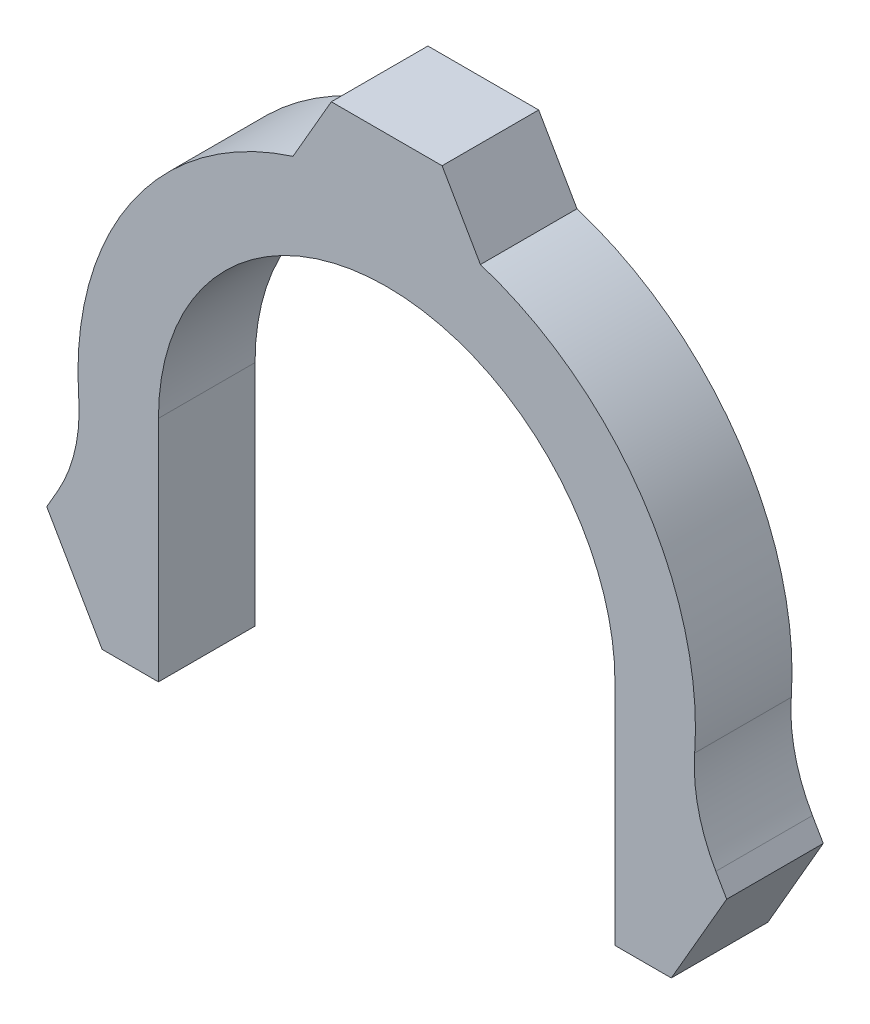
ISO-10303-21;
HEADER;
FILE_DESCRIPTION(('STEP AP214'),'2;1');
FILE_NAME('part.step','',(''),(''),'','','');
FILE_SCHEMA(('AUTOMOTIVE_DESIGN { 1 0 10303 214 1 1 1 1 }'));
ENDSEC;
DATA;
#1=APPLICATION_CONTEXT('core data for automotive mechanical design processes');
#2=APPLICATION_PROTOCOL_DEFINITION('international standard','automotive_design',2000,#1);
#3=PRODUCT_CONTEXT('',#1,'mechanical');
#4=PRODUCT('Part','Part','',(#3));
#5=PRODUCT_RELATED_PRODUCT_CATEGORY('part','',(#4));
#6=PRODUCT_DEFINITION_FORMATION('','',#4);
#7=PRODUCT_DEFINITION_CONTEXT('part definition',#1,'design');
#8=PRODUCT_DEFINITION('design','',#6,#7);
#9=PRODUCT_DEFINITION_SHAPE('','',#8);
#10=(LENGTH_UNIT() NAMED_UNIT(*) SI_UNIT(.MILLI.,.METRE.));
#11=(NAMED_UNIT(*) PLANE_ANGLE_UNIT() SI_UNIT($,.RADIAN.));
#12=(NAMED_UNIT(*) SI_UNIT($,.STERADIAN.) SOLID_ANGLE_UNIT());
#13=UNCERTAINTY_MEASURE_WITH_UNIT(LENGTH_MEASURE(1.E-05),#10,'distance_accuracy_value','');
#14=(GEOMETRIC_REPRESENTATION_CONTEXT(3) GLOBAL_UNCERTAINTY_ASSIGNED_CONTEXT((#13)) GLOBAL_UNIT_ASSIGNED_CONTEXT((#10,
#11,#12)) REPRESENTATION_CONTEXT('',''));
#15=CARTESIAN_POINT('',(0.,0.,0.));
#16=DIRECTION('',(0.,0.,1.));
#17=DIRECTION('',(1.,0.,0.));
#18=AXIS2_PLACEMENT_3D('',#15,#16,#17);
#19=CARTESIAN_POINT('',(13.0760529111176,45.988107250102,12.));
#20=DIRECTION('',(0.,0.,-1.));
#21=DIRECTION('',(-1.,0.,0.));
#22=AXIS2_PLACEMENT_3D('',#19,#20,#21);
#23=CYLINDRICAL_SURFACE('',#22,20.);
#24=CARTESIAN_POINT('',(13.0760529111176,45.988107250102,0.));
#25=DIRECTION('',(0.,0.,-1.));
#26=DIRECTION('',(-1.,0.,0.));
#27=AXIS2_PLACEMENT_3D('',#24,#25,#26);
#28=CIRCLE('',#27,20.);
#29=CARTESIAN_POINT('',(-4.24445516457117,35.988107250102,0.));
#30=VERTEX_POINT('',#29);
#31=CARTESIAN_POINT('',(-6.8742487352404,47.3971722661056,0.));
#32=VERTEX_POINT('',#31);
#33=EDGE_CURVE('E178',#30,#32,#28,.T.);
#34=ORIENTED_EDGE('',*,*,#33,.T.);
#35=DIRECTION('',(0.,0.,-1.));
#36=VECTOR('',#35,1.);
#37=CARTESIAN_POINT('',(-6.8742487352404,47.3971722661056,12.));
#38=LINE('',#37,#36);
#39=CARTESIAN_POINT('',(-6.8742487352404,47.3971722661056,12.));
#40=VERTEX_POINT('',#39);
#41=EDGE_CURVE('E11',#40,#32,#38,.T.);
#42=ORIENTED_EDGE('',*,*,#41,.F.);
#43=CARTESIAN_POINT('',(13.0760529111176,45.988107250102,12.));
#44=DIRECTION('',(0.,0.,-1.));
#45=DIRECTION('',(-1.,0.,0.));
#46=AXIS2_PLACEMENT_3D('',#43,#44,#45);
#47=CIRCLE('',#46,20.);
#48=CARTESIAN_POINT('',(-4.24445516457117,35.988107250102,12.));
#49=VERTEX_POINT('',#48);
#50=EDGE_CURVE('E179',#49,#40,#47,.T.);
#51=ORIENTED_EDGE('',*,*,#50,.F.);
#52=DIRECTION('',(0.,0.,-1.));
#53=VECTOR('',#52,1.);
#54=CARTESIAN_POINT('',(-4.24445516457117,35.988107250102,12.));
#55=LINE('',#54,#53);
#56=EDGE_CURVE('E189',#49,#30,#55,.T.);
#57=ORIENTED_EDGE('',*,*,#56,.T.);
#58=EDGE_LOOP('',(#34,#42,#51,#57));
#59=FACE_BOUND('',#58,.T.);
#60=ADVANCED_FACE('F41',(#59),#23,.F.);
#61=CARTESIAN_POINT('',(-45.1379136666298,50.0996873756325,12.));
#62=DIRECTION('',(0.,0.,-1.));
#63=DIRECTION('',(-1.,0.,0.));
#64=AXIS2_PLACEMENT_3D('',#61,#62,#63);
#65=CYLINDRICAL_SURFACE('',#64,38.3589838486223);
#66=CARTESIAN_POINT('',(-45.1379136666298,50.0996873756325,0.));
#67=DIRECTION('',(0.,0.,1.));
#68=DIRECTION('',(1.,0.,0.));
#69=AXIS2_PLACEMENT_3D('',#66,#67,#68);
#70=CIRCLE('',#69,38.3589838486223);
#71=CARTESIAN_POINT('',(-33.4932239612782,86.6484608648338,0.));
#72=VERTEX_POINT('',#71);
#73=EDGE_CURVE('E222',#32,#72,#70,.T.);
#74=ORIENTED_EDGE('',*,*,#73,.T.);
#75=DIRECTION('',(0.,0.,-1.));
#76=VECTOR('',#75,1.);
#77=CARTESIAN_POINT('',(-33.4932239612782,86.6484608648338,12.));
#78=LINE('',#77,#76);
#79=CARTESIAN_POINT('',(-33.4932239612782,86.6484608648338,12.));
#80=VERTEX_POINT('',#79);
#81=EDGE_CURVE('E48',#80,#72,#78,.T.);
#82=ORIENTED_EDGE('',*,*,#81,.F.);
#83=CARTESIAN_POINT('',(-45.1379136666298,50.0996873756325,12.));
#84=DIRECTION('',(0.,0.,1.));
#85=DIRECTION('',(1.,0.,0.));
#86=AXIS2_PLACEMENT_3D('',#83,#84,#85);
#87=CIRCLE('',#86,38.3589838486223);
#88=EDGE_CURVE('E183',#40,#80,#87,.T.);
#89=ORIENTED_EDGE('',*,*,#88,.F.);
#90=ORIENTED_EDGE('',*,*,#41,.T.);
#91=EDGE_LOOP('',(#74,#82,#89,#90));
#92=FACE_BOUND('',#91,.T.);
#93=ADVANCED_FACE('F338',(#92),#65,.T.);
#94=CARTESIAN_POINT('',(-33.4932239612782,86.6484608648338,12.));
#95=DIRECTION('',(-0.866025403784438,-0.500000000000001,0.));
#96=DIRECTION('',(0.500000000000001,-0.866025403784438,0.));
#97=AXIS2_PLACEMENT_3D('',#94,#95,#96);
#98=PLANE('',#97);
#99=DIRECTION('',(-0.500000000000001,0.866025403784438,0.));
#100=VECTOR('',#99,1.);
#101=CARTESIAN_POINT('',(-33.4932239612782,86.6484608648338,0.));
#102=LINE('',#101,#100);
#103=CARTESIAN_POINT('',(-38.2570718084324,94.8996873756326,0.));
#104=VERTEX_POINT('',#103);
#105=EDGE_CURVE('E218',#72,#104,#102,.T.);
#106=ORIENTED_EDGE('',*,*,#105,.T.);
#107=DIRECTION('',(0.,0.,1.));
#108=VECTOR('',#107,1.);
#109=CARTESIAN_POINT('',(-38.2570718084324,94.8996873756326,0.));
#110=LINE('',#109,#108);
#111=CARTESIAN_POINT('',(-38.2570718084324,94.8996873756326,12.));
#112=VERTEX_POINT('',#111);
#113=EDGE_CURVE('E57',#104,#112,#110,.T.);
#114=ORIENTED_EDGE('',*,*,#113,.T.);
#115=DIRECTION('',(-0.500000000000001,0.866025403784438,0.));
#116=VECTOR('',#115,1.);
#117=CARTESIAN_POINT('',(-33.4932239612782,86.6484608648338,12.));
#118=LINE('',#117,#116);
#119=EDGE_CURVE('E220',#80,#112,#118,.T.);
#120=ORIENTED_EDGE('',*,*,#119,.F.);
#121=ORIENTED_EDGE('',*,*,#81,.T.);
#122=EDGE_LOOP('',(#106,#114,#120,#121));
#123=FACE_BOUND('',#122,.T.);
#124=ADVANCED_FACE('F217',(#123),#98,.F.);
#125=CARTESIAN_POINT('',(-45.1379136666299,106.817655072877,12.));
#126=DIRECTION('',(0.866025403784439,-0.5,0.));
#127=DIRECTION('',(0.5,0.866025403784439,0.));
#128=AXIS2_PLACEMENT_3D('',#125,#126,#127);
#129=PLANE('',#128);
#130=DIRECTION('',(-0.5,-0.866025403784439,0.));
#131=VECTOR('',#130,1.);
#132=CARTESIAN_POINT('',(-45.1379136666299,106.817655072877,12.));
#133=LINE('',#132,#131);
#134=CARTESIAN_POINT('',(-52.0187555248272,94.8996873756326,12.));
#135=VERTEX_POINT('',#134);
#136=CARTESIAN_POINT('',(-56.7826033719815,86.6484608648338,12.));
#137=VERTEX_POINT('',#136);
#138=EDGE_CURVE('E287',#135,#137,#133,.T.);
#139=ORIENTED_EDGE('',*,*,#138,.F.);
#140=DIRECTION('',(0.,0.,1.));
#141=VECTOR('',#140,1.);
#142=CARTESIAN_POINT('',(-52.0187555248272,94.8996873756326,0.));
#143=LINE('',#142,#141);
#144=CARTESIAN_POINT('',(-52.0187555248272,94.8996873756326,0.));
#145=VERTEX_POINT('',#144);
#146=EDGE_CURVE('E278',#145,#135,#143,.T.);
#147=ORIENTED_EDGE('',*,*,#146,.F.);
#148=DIRECTION('',(-0.5,-0.866025403784439,0.));
#149=VECTOR('',#148,1.);
#150=CARTESIAN_POINT('',(-45.1379136666299,106.817655072877,0.));
#151=LINE('',#150,#149);
#152=CARTESIAN_POINT('',(-56.7826033719815,86.6484608648338,0.));
#153=VERTEX_POINT('',#152);
#154=EDGE_CURVE('E226',#145,#153,#151,.T.);
#155=ORIENTED_EDGE('',*,*,#154,.T.);
#156=DIRECTION('',(0.,0.,-1.));
#157=VECTOR('',#156,1.);
#158=CARTESIAN_POINT('',(-56.7826033719815,86.6484608648338,12.));
#159=LINE('',#158,#157);
#160=EDGE_CURVE('E209',#137,#153,#159,.T.);
#161=ORIENTED_EDGE('',*,*,#160,.F.);
#162=EDGE_LOOP('',(#139,#147,#155,#161));
#163=FACE_BOUND('',#162,.T.);
#164=ADVANCED_FACE('F333',(#163),#129,.F.);
#165=CARTESIAN_POINT('',(-45.1379136666298,50.0996873756325,12.));
#166=DIRECTION('',(0.,0.,-1.));
#167=DIRECTION('',(-1.,0.,0.));
#168=AXIS2_PLACEMENT_3D('',#165,#166,#167);
#169=CYLINDRICAL_SURFACE('',#168,38.3589838486223);
#170=CARTESIAN_POINT('',(-45.1379136666298,50.0996873756325,0.));
#171=DIRECTION('',(0.,0.,1.));
#172=DIRECTION('',(1.,0.,0.));
#173=AXIS2_PLACEMENT_3D('',#170,#171,#172);
#174=CIRCLE('',#173,38.3589838486223);
#175=CARTESIAN_POINT('',(-83.4015785980193,47.3971722661056,0.));
#176=VERTEX_POINT('',#175);
#177=EDGE_CURVE('E230',#153,#176,#174,.T.);
#178=ORIENTED_EDGE('',*,*,#177,.T.);
#179=DIRECTION('',(0.,0.,-1.));
#180=VECTOR('',#179,1.);
#181=CARTESIAN_POINT('',(-83.4015785980193,47.3971722661056,12.));
#182=LINE('',#181,#180);
#183=CARTESIAN_POINT('',(-83.4015785980193,47.3971722661056,12.));
#184=VERTEX_POINT('',#183);
#185=EDGE_CURVE('E206',#184,#176,#182,.T.);
#186=ORIENTED_EDGE('',*,*,#185,.F.);
#187=CARTESIAN_POINT('',(-45.1379136666298,50.0996873756325,12.));
#188=DIRECTION('',(0.,0.,1.));
#189=DIRECTION('',(1.,0.,0.));
#190=AXIS2_PLACEMENT_3D('',#187,#188,#189);
#191=CIRCLE('',#190,38.3589838486223);
#192=EDGE_CURVE('E289',#137,#184,#191,.T.);
#193=ORIENTED_EDGE('',*,*,#192,.F.);
#194=ORIENTED_EDGE('',*,*,#160,.T.);
#195=EDGE_LOOP('',(#178,#186,#193,#194));
#196=FACE_BOUND('',#195,.T.);
#197=ADVANCED_FACE('F329',(#196),#169,.T.);
#198=CARTESIAN_POINT('',(-103.351880244377,45.988107250102,12.));
#199=DIRECTION('',(0.,0.,-1.));
#200=DIRECTION('',(-1.,0.,0.));
#201=AXIS2_PLACEMENT_3D('',#198,#199,#200);
#202=CYLINDRICAL_SURFACE('',#201,20.);
#203=CARTESIAN_POINT('',(-103.351880244377,45.988107250102,0.));
#204=DIRECTION('',(0.,0.,-1.));
#205=DIRECTION('',(-1.,0.,0.));
#206=AXIS2_PLACEMENT_3D('',#203,#204,#205);
#207=CIRCLE('',#206,20.);
#208=CARTESIAN_POINT('',(-86.0313721686885,35.988107250102,0.));
#209=VERTEX_POINT('',#208);
#210=EDGE_CURVE('E236',#176,#209,#207,.T.);
#211=ORIENTED_EDGE('',*,*,#210,.T.);
#212=DIRECTION('',(0.,0.,-1.));
#213=VECTOR('',#212,1.);
#214=CARTESIAN_POINT('',(-86.0313721686885,35.988107250102,12.));
#215=LINE('',#214,#213);
#216=CARTESIAN_POINT('',(-86.0313721686885,35.988107250102,12.));
#217=VERTEX_POINT('',#216);
#218=EDGE_CURVE('E203',#217,#209,#215,.T.);
#219=ORIENTED_EDGE('',*,*,#218,.F.);
#220=CARTESIAN_POINT('',(-103.351880244377,45.988107250102,12.));
#221=DIRECTION('',(0.,0.,-1.));
#222=DIRECTION('',(-1.,0.,0.));
#223=AXIS2_PLACEMENT_3D('',#220,#221,#222);
#224=CIRCLE('',#223,20.);
#225=EDGE_CURVE('E291',#184,#217,#224,.T.);
#226=ORIENTED_EDGE('',*,*,#225,.F.);
#227=ORIENTED_EDGE('',*,*,#185,.T.);
#228=EDGE_LOOP('',(#211,#219,#226,#227));
#229=FACE_BOUND('',#228,.T.);
#230=ADVANCED_FACE('F325',(#229),#202,.F.);
#231=CARTESIAN_POINT('',(-86.0313721686885,35.988107250102,12.));
#232=DIRECTION('',(0.866025403784439,-0.5,0.));
#233=DIRECTION('',(0.5,0.866025403784439,0.));
#234=AXIS2_PLACEMENT_3D('',#231,#232,#233);
#235=PLANE('',#234);
#236=DIRECTION('',(-0.5,-0.866025403784439,0.));
#237=VECTOR('',#236,1.);
#238=CARTESIAN_POINT('',(-86.0313721686885,35.988107250102,0.));
#239=LINE('',#238,#237);
#240=CARTESIAN_POINT('',(-87.3762726852714,33.6586712242549,0.));
#241=VERTEX_POINT('',#240);
#242=EDGE_CURVE('E238',#209,#241,#239,.T.);
#243=ORIENTED_EDGE('',*,*,#242,.T.);
#244=DIRECTION('',(0.,0.,1.));
#245=VECTOR('',#244,1.);
#246=CARTESIAN_POINT('',(-87.3762726852714,33.6586712242549,0.));
#247=LINE('',#246,#245);
#248=CARTESIAN_POINT('',(-87.3762726852714,33.6586712242549,12.));
#249=VERTEX_POINT('',#248);
#250=EDGE_CURVE('E65',#241,#249,#247,.T.);
#251=ORIENTED_EDGE('',*,*,#250,.T.);
#252=DIRECTION('',(-0.5,-0.866025403784439,0.));
#253=VECTOR('',#252,1.);
#254=CARTESIAN_POINT('',(-86.0313721686885,35.988107250102,12.));
#255=LINE('',#254,#253);
#256=EDGE_CURVE('E293',#217,#249,#255,.T.);
#257=ORIENTED_EDGE('',*,*,#256,.F.);
#258=ORIENTED_EDGE('',*,*,#218,.T.);
#259=EDGE_LOOP('',(#243,#251,#257,#258));
#260=FACE_BOUND('',#259,.T.);
#261=ADVANCED_FACE('F320',(#260),#235,.F.);
#262=CARTESIAN_POINT('',(-94.2571145434688,21.7407035270103,12.));
#263=DIRECTION('',(0.,1.,0.));
#264=DIRECTION('',(-1.,0.,0.));
#265=AXIS2_PLACEMENT_3D('',#262,#263,#264);
#266=PLANE('',#265);
#267=DIRECTION('',(1.,0.,0.));
#268=VECTOR('',#267,1.);
#269=CARTESIAN_POINT('',(-94.2571145434688,21.7407035270103,12.));
#270=LINE('',#269,#268);
#271=CARTESIAN_POINT('',(-80.4954308270741,21.7407035270103,12.));
#272=VERTEX_POINT('',#271);
#273=CARTESIAN_POINT('',(-73.4968975152521,21.7407035270103,12.));
#274=VERTEX_POINT('',#273);
#275=EDGE_CURVE('E296',#272,#274,#270,.T.);
#276=ORIENTED_EDGE('',*,*,#275,.F.);
#277=DIRECTION('',(0.,0.,1.));
#278=VECTOR('',#277,1.);
#279=CARTESIAN_POINT('',(-80.4954308270741,21.7407035270103,0.));
#280=LINE('',#279,#278);
#281=CARTESIAN_POINT('',(-80.4954308270741,21.7407035270103,0.));
#282=VERTEX_POINT('',#281);
#283=EDGE_CURVE('E272',#282,#272,#280,.T.);
#284=ORIENTED_EDGE('',*,*,#283,.F.);
#285=DIRECTION('',(1.,0.,0.));
#286=VECTOR('',#285,1.);
#287=CARTESIAN_POINT('',(-94.2571145434688,21.7407035270103,0.));
#288=LINE('',#287,#286);
#289=CARTESIAN_POINT('',(-73.4968975152521,21.7407035270103,0.));
#290=VERTEX_POINT('',#289);
#291=EDGE_CURVE('E241',#282,#290,#288,.T.);
#292=ORIENTED_EDGE('',*,*,#291,.T.);
#293=DIRECTION('',(0.,0.,-1.));
#294=VECTOR('',#293,1.);
#295=CARTESIAN_POINT('',(-73.4968975152521,21.7407035270103,12.));
#296=LINE('',#295,#294);
#297=EDGE_CURVE('E200',#274,#290,#296,.T.);
#298=ORIENTED_EDGE('',*,*,#297,.F.);
#299=EDGE_LOOP('',(#276,#284,#292,#298));
#300=FACE_BOUND('',#299,.T.);
#301=ADVANCED_FACE('F312',(#300),#266,.F.);
#302=CARTESIAN_POINT('',(-73.4968975152521,50.0996873756325,12.));
#303=DIRECTION('',(-1.,0.,0.));
#304=DIRECTION('',(0.,0.,1.));
#305=AXIS2_PLACEMENT_3D('',#302,#303,#304);
#306=PLANE('',#305);
#307=DIRECTION('',(0.,1.,0.));
#308=VECTOR('',#307,1.);
#309=CARTESIAN_POINT('',(-73.4968975152521,50.0996873756325,0.));
#310=LINE('',#309,#308);
#311=CARTESIAN_POINT('',(-73.4968975152521,50.0996873756325,0.));
#312=VERTEX_POINT('',#311);
#313=EDGE_CURVE('E243',#290,#312,#310,.T.);
#314=ORIENTED_EDGE('',*,*,#313,.T.);
#315=DIRECTION('',(0.,0.,-1.));
#316=VECTOR('',#315,1.);
#317=CARTESIAN_POINT('',(-73.4968975152521,50.0996873756325,12.));
#318=LINE('',#317,#316);
#319=CARTESIAN_POINT('',(-73.4968975152521,50.0996873756325,12.));
#320=VERTEX_POINT('',#319);
#321=EDGE_CURVE('E197',#320,#312,#318,.T.);
#322=ORIENTED_EDGE('',*,*,#321,.F.);
#323=DIRECTION('',(0.,1.,0.));
#324=VECTOR('',#323,1.);
#325=CARTESIAN_POINT('',(-73.4968975152521,50.0996873756325,12.));
#326=LINE('',#325,#324);
#327=EDGE_CURVE('E298',#274,#320,#326,.T.);
#328=ORIENTED_EDGE('',*,*,#327,.F.);
#329=ORIENTED_EDGE('',*,*,#297,.T.);
#330=EDGE_LOOP('',(#314,#322,#328,#329));
#331=FACE_BOUND('',#330,.T.);
#332=ADVANCED_FACE('F308',(#331),#306,.F.);
#333=CARTESIAN_POINT('',(-45.1379136666298,50.0996873756325,12.));
#334=DIRECTION('',(0.,0.,-1.));
#335=DIRECTION('',(-1.,0.,0.));
#336=AXIS2_PLACEMENT_3D('',#333,#334,#335);
#337=CYLINDRICAL_SURFACE('',#336,28.3589838486223);
#338=CARTESIAN_POINT('',(-45.1379136666298,50.0996873756325,0.));
#339=DIRECTION('',(0.,0.,-1.));
#340=DIRECTION('',(1.,0.,0.));
#341=AXIS2_PLACEMENT_3D('',#338,#339,#340);
#342=CIRCLE('',#341,28.3589838486223);
#343=CARTESIAN_POINT('',(-16.7789298180076,50.0996873756325,0.));
#344=VERTEX_POINT('',#343);
#345=EDGE_CURVE('E245',#312,#344,#342,.T.);
#346=ORIENTED_EDGE('',*,*,#345,.T.);
#347=DIRECTION('',(0.,0.,-1.));
#348=VECTOR('',#347,1.);
#349=CARTESIAN_POINT('',(-16.7789298180076,50.0996873756325,12.));
#350=LINE('',#349,#348);
#351=CARTESIAN_POINT('',(-16.7789298180076,50.0996873756325,12.));
#352=VERTEX_POINT('',#351);
#353=EDGE_CURVE('E194',#352,#344,#350,.T.);
#354=ORIENTED_EDGE('',*,*,#353,.F.);
#355=CARTESIAN_POINT('',(-45.1379136666298,50.0996873756325,12.));
#356=DIRECTION('',(0.,0.,-1.));
#357=DIRECTION('',(1.,0.,0.));
#358=AXIS2_PLACEMENT_3D('',#355,#356,#357);
#359=CIRCLE('',#358,28.3589838486223);
#360=EDGE_CURVE('E262',#320,#352,#359,.T.);
#361=ORIENTED_EDGE('',*,*,#360,.F.);
#362=ORIENTED_EDGE('',*,*,#321,.T.);
#363=EDGE_LOOP('',(#346,#354,#361,#362));
#364=FACE_BOUND('',#363,.T.);
#365=ADVANCED_FACE('F304',(#364),#337,.F.);
#366=CARTESIAN_POINT('',(-16.7789298180076,50.0996873756325,12.));
#367=DIRECTION('',(1.,0.,0.));
#368=DIRECTION('',(0.,1.,0.));
#369=AXIS2_PLACEMENT_3D('',#366,#367,#368);
#370=PLANE('',#369);
#371=DIRECTION('',(0.,-1.,0.));
#372=VECTOR('',#371,1.);
#373=CARTESIAN_POINT('',(-16.7789298180076,50.0996873756325,0.));
#374=LINE('',#373,#372);
#375=CARTESIAN_POINT('',(-16.7789298180076,21.7407035270103,0.));
#376=VERTEX_POINT('',#375);
#377=EDGE_CURVE('E185',#344,#376,#374,.T.);
#378=ORIENTED_EDGE('',*,*,#377,.T.);
#379=DIRECTION('',(0.,0.,-1.));
#380=VECTOR('',#379,1.);
#381=CARTESIAN_POINT('',(-16.7789298180076,21.7407035270103,12.));
#382=LINE('',#381,#380);
#383=CARTESIAN_POINT('',(-16.7789298180076,21.7407035270103,12.));
#384=VERTEX_POINT('',#383);
#385=EDGE_CURVE('E191',#384,#376,#382,.T.);
#386=ORIENTED_EDGE('',*,*,#385,.F.);
#387=DIRECTION('',(0.,-1.,0.));
#388=VECTOR('',#387,1.);
#389=CARTESIAN_POINT('',(-16.7789298180076,50.0996873756325,12.));
#390=LINE('',#389,#388);
#391=EDGE_CURVE('E259',#352,#384,#390,.T.);
#392=ORIENTED_EDGE('',*,*,#391,.F.);
#393=ORIENTED_EDGE('',*,*,#353,.T.);
#394=EDGE_LOOP('',(#378,#386,#392,#393));
#395=FACE_BOUND('',#394,.T.);
#396=ADVANCED_FACE('F249',(#395),#370,.F.);
#397=CARTESIAN_POINT('',(-16.7789298180076,21.7407035270103,12.));
#398=DIRECTION('',(0.,1.,0.));
#399=DIRECTION('',(-1.,0.,0.));
#400=AXIS2_PLACEMENT_3D('',#397,#398,#399);
#401=PLANE('',#400);
#402=DIRECTION('',(1.,0.,0.));
#403=VECTOR('',#402,1.);
#404=CARTESIAN_POINT('',(-16.7789298180076,21.7407035270103,0.));
#405=LINE('',#404,#403);
#406=CARTESIAN_POINT('',(-9.78039650618572,21.7407035270103,0.));
#407=VERTEX_POINT('',#406);
#408=EDGE_CURVE('E180',#376,#407,#405,.T.);
#409=ORIENTED_EDGE('',*,*,#408,.T.);
#410=DIRECTION('',(0.,0.,1.));
#411=VECTOR('',#410,1.);
#412=CARTESIAN_POINT('',(-9.78039650618572,21.7407035270103,0.));
#413=LINE('',#412,#411);
#414=CARTESIAN_POINT('',(-9.78039650618572,21.7407035270103,12.));
#415=VERTEX_POINT('',#414);
#416=EDGE_CURVE('E160',#407,#415,#413,.T.);
#417=ORIENTED_EDGE('',*,*,#416,.T.);
#418=DIRECTION('',(1.,0.,0.));
#419=VECTOR('',#418,1.);
#420=CARTESIAN_POINT('',(-16.7789298180076,21.7407035270103,12.));
#421=LINE('',#420,#419);
#422=EDGE_CURVE('E257',#384,#415,#421,.T.);
#423=ORIENTED_EDGE('',*,*,#422,.F.);
#424=ORIENTED_EDGE('',*,*,#385,.T.);
#425=EDGE_LOOP('',(#409,#417,#423,#424));
#426=FACE_BOUND('',#425,.T.);
#427=ADVANCED_FACE('F255',(#426),#401,.F.);
#428=CARTESIAN_POINT('',(3.98128721020911,21.7407035270103,12.));
#429=DIRECTION('',(-0.866025403784439,-0.5,0.));
#430=DIRECTION('',(0.5,-0.866025403784439,0.));
#431=AXIS2_PLACEMENT_3D('',#428,#429,#430);
#432=PLANE('',#431);
#433=DIRECTION('',(-0.5,0.866025403784439,0.));
#434=VECTOR('',#433,1.);
#435=CARTESIAN_POINT('',(3.98128721020911,21.7407035270103,12.));
#436=LINE('',#435,#434);
#437=CARTESIAN_POINT('',(-2.89955464798827,33.6586712242548,12.));
#438=VERTEX_POINT('',#437);
#439=EDGE_CURVE('E173',#438,#49,#436,.T.);
#440=ORIENTED_EDGE('',*,*,#439,.F.);
#441=DIRECTION('',(0.,0.,1.));
#442=VECTOR('',#441,1.);
#443=CARTESIAN_POINT('',(-2.89955464798827,33.6586712242548,0.));
#444=LINE('',#443,#442);
#445=CARTESIAN_POINT('',(-2.89955464798827,33.6586712242548,0.));
#446=VERTEX_POINT('',#445);
#447=EDGE_CURVE('E157',#446,#438,#444,.T.);
#448=ORIENTED_EDGE('',*,*,#447,.F.);
#449=DIRECTION('',(-0.5,0.866025403784439,0.));
#450=VECTOR('',#449,1.);
#451=CARTESIAN_POINT('',(3.98128721020911,21.7407035270103,0.));
#452=LINE('',#451,#450);
#453=EDGE_CURVE('E171',#446,#30,#452,.T.);
#454=ORIENTED_EDGE('',*,*,#453,.T.);
#455=ORIENTED_EDGE('',*,*,#56,.F.);
#456=EDGE_LOOP('',(#440,#448,#454,#455));
#457=FACE_BOUND('',#456,.T.);
#458=ADVANCED_FACE('F169',(#457),#432,.F.);
#459=CARTESIAN_POINT('',(13.0760529111176,45.988107250102,12.));
#460=DIRECTION('',(0.,0.,-1.));
#461=DIRECTION('',(-1.,0.,0.));
#462=AXIS2_PLACEMENT_3D('',#459,#460,#461);
#463=PLANE('',#462);
#464=ORIENTED_EDGE('',*,*,#422,.T.);
#465=DIRECTION('',(-0.500000000000004,-0.866025403784436,0.));
#466=VECTOR('',#465,1.);
#467=CARTESIAN_POINT('',(-2.89955464798827,33.6586712242548,12.));
#468=LINE('',#467,#466);
#469=EDGE_CURVE('E165',#438,#415,#468,.T.);
#470=ORIENTED_EDGE('',*,*,#469,.F.);
#471=ORIENTED_EDGE('',*,*,#439,.T.);
#472=ORIENTED_EDGE('',*,*,#50,.T.);
#473=ORIENTED_EDGE('',*,*,#88,.T.);
#474=ORIENTED_EDGE('',*,*,#119,.T.);
#475=DIRECTION('',(1.,0.,0.));
#476=VECTOR('',#475,1.);
#477=CARTESIAN_POINT('',(-52.0187555248272,94.8996873756326,12.));
#478=LINE('',#477,#476);
#479=EDGE_CURVE('E279',#135,#112,#478,.T.);
#480=ORIENTED_EDGE('',*,*,#479,.F.);
#481=ORIENTED_EDGE('',*,*,#138,.T.);
#482=ORIENTED_EDGE('',*,*,#192,.T.);
#483=ORIENTED_EDGE('',*,*,#225,.T.);
#484=ORIENTED_EDGE('',*,*,#256,.T.);
#485=DIRECTION('',(-0.499999999999992,0.866025403784443,0.));
#486=VECTOR('',#485,1.);
#487=CARTESIAN_POINT('',(-80.4954308270741,21.7407035270103,12.));
#488=LINE('',#487,#486);
#489=EDGE_CURVE('E273',#272,#249,#488,.T.);
#490=ORIENTED_EDGE('',*,*,#489,.F.);
#491=ORIENTED_EDGE('',*,*,#275,.T.);
#492=ORIENTED_EDGE('',*,*,#327,.T.);
#493=ORIENTED_EDGE('',*,*,#360,.T.);
#494=ORIENTED_EDGE('',*,*,#391,.T.);
#495=EDGE_LOOP('',(#464,#470,#471,#472,#473,#474,#480,#481,#482,#483,#484,#490,#491,#492,#493,#494));
#496=FACE_BOUND('',#495,.T.);
#497=ADVANCED_FACE('F300',(#496),#463,.F.);
#498=CARTESIAN_POINT('',(13.0760529111176,45.988107250102,0.));
#499=DIRECTION('',(0.,0.,-1.));
#500=DIRECTION('',(-1.,0.,0.));
#501=AXIS2_PLACEMENT_3D('',#498,#499,#500);
#502=PLANE('',#501);
#503=DIRECTION('',(-0.500000000000004,-0.866025403784436,0.));
#504=VECTOR('',#503,1.);
#505=CARTESIAN_POINT('',(-2.89955464798827,33.6586712242548,0.));
#506=LINE('',#505,#504);
#507=EDGE_CURVE('E154',#446,#407,#506,.T.);
#508=ORIENTED_EDGE('',*,*,#507,.T.);
#509=ORIENTED_EDGE('',*,*,#408,.F.);
#510=ORIENTED_EDGE('',*,*,#377,.F.);
#511=ORIENTED_EDGE('',*,*,#345,.F.);
#512=ORIENTED_EDGE('',*,*,#313,.F.);
#513=ORIENTED_EDGE('',*,*,#291,.F.);
#514=DIRECTION('',(-0.499999999999992,0.866025403784443,0.));
#515=VECTOR('',#514,1.);
#516=CARTESIAN_POINT('',(-80.4954308270741,21.7407035270103,0.));
#517=LINE('',#516,#515);
#518=EDGE_CURVE('E270',#282,#241,#517,.T.);
#519=ORIENTED_EDGE('',*,*,#518,.T.);
#520=ORIENTED_EDGE('',*,*,#242,.F.);
#521=ORIENTED_EDGE('',*,*,#210,.F.);
#522=ORIENTED_EDGE('',*,*,#177,.F.);
#523=ORIENTED_EDGE('',*,*,#154,.F.);
#524=DIRECTION('',(1.,0.,0.));
#525=VECTOR('',#524,1.);
#526=CARTESIAN_POINT('',(-52.0187555248272,94.8996873756326,0.));
#527=LINE('',#526,#525);
#528=EDGE_CURVE('E224',#145,#104,#527,.T.);
#529=ORIENTED_EDGE('',*,*,#528,.T.);
#530=ORIENTED_EDGE('',*,*,#105,.F.);
#531=ORIENTED_EDGE('',*,*,#73,.F.);
#532=ORIENTED_EDGE('',*,*,#33,.F.);
#533=ORIENTED_EDGE('',*,*,#453,.F.);
#534=EDGE_LOOP('',(#508,#509,#510,#511,#512,#513,#519,#520,#521,#522,#523,#529,#530,#531,#532,#533));
#535=FACE_BOUND('',#534,.T.);
#536=ADVANCED_FACE('F176',(#535),#502,.T.);
#537=CARTESIAN_POINT('',(-52.0187555248272,94.8996873756326,0.));
#538=DIRECTION('',(0.,-1.,0.));
#539=DIRECTION('',(0.,0.,-1.));
#540=AXIS2_PLACEMENT_3D('',#537,#538,#539);
#541=PLANE('',#540);
#542=ORIENTED_EDGE('',*,*,#479,.T.);
#543=ORIENTED_EDGE('',*,*,#113,.F.);
#544=ORIENTED_EDGE('',*,*,#528,.F.);
#545=ORIENTED_EDGE('',*,*,#146,.T.);
#546=EDGE_LOOP('',(#542,#543,#544,#545));
#547=FACE_BOUND('',#546,.T.);
#548=ADVANCED_FACE('F336',(#547),#541,.F.);
#549=CARTESIAN_POINT('',(-80.4954308270741,21.7407035270103,0.));
#550=DIRECTION('',(0.866025403784443,0.499999999999992,0.));
#551=DIRECTION('',(-0.499999999999993,0.866025403784443,0.));
#552=AXIS2_PLACEMENT_3D('',#549,#550,#551);
#553=PLANE('',#552);
#554=ORIENTED_EDGE('',*,*,#489,.T.);
#555=ORIENTED_EDGE('',*,*,#250,.F.);
#556=ORIENTED_EDGE('',*,*,#518,.F.);
#557=ORIENTED_EDGE('',*,*,#283,.T.);
#558=EDGE_LOOP('',(#554,#555,#556,#557));
#559=FACE_BOUND('',#558,.T.);
#560=ADVANCED_FACE('F315',(#559),#553,.F.);
#561=CARTESIAN_POINT('',(-2.89955464798827,33.6586712242548,0.));
#562=DIRECTION('',(-0.866025403784436,0.500000000000004,0.));
#563=DIRECTION('',(-0.500000000000004,-0.866025403784436,0.));
#564=AXIS2_PLACEMENT_3D('',#561,#562,#563);
#565=PLANE('',#564);
#566=ORIENTED_EDGE('',*,*,#469,.T.);
#567=ORIENTED_EDGE('',*,*,#416,.F.);
#568=ORIENTED_EDGE('',*,*,#507,.F.);
#569=ORIENTED_EDGE('',*,*,#447,.T.);
#570=EDGE_LOOP('',(#566,#567,#568,#569));
#571=FACE_BOUND('',#570,.T.);
#572=ADVANCED_FACE('F156',(#571),#565,.F.);
#573=CLOSED_SHELL('',(#60,#93,#124,#164,#197,#230,#261,#301,#332,#365,#396,#427,#458,#497,#536,
#548,#560,#572));
#574=MANIFOLD_SOLID_BREP('B2',#573);
#575=ADVANCED_BREP_SHAPE_REPRESENTATION('',(#18,#574),#14);
#576=SHAPE_DEFINITION_REPRESENTATION(#9,#575);
ENDSEC;
END-ISO-10303-21;
